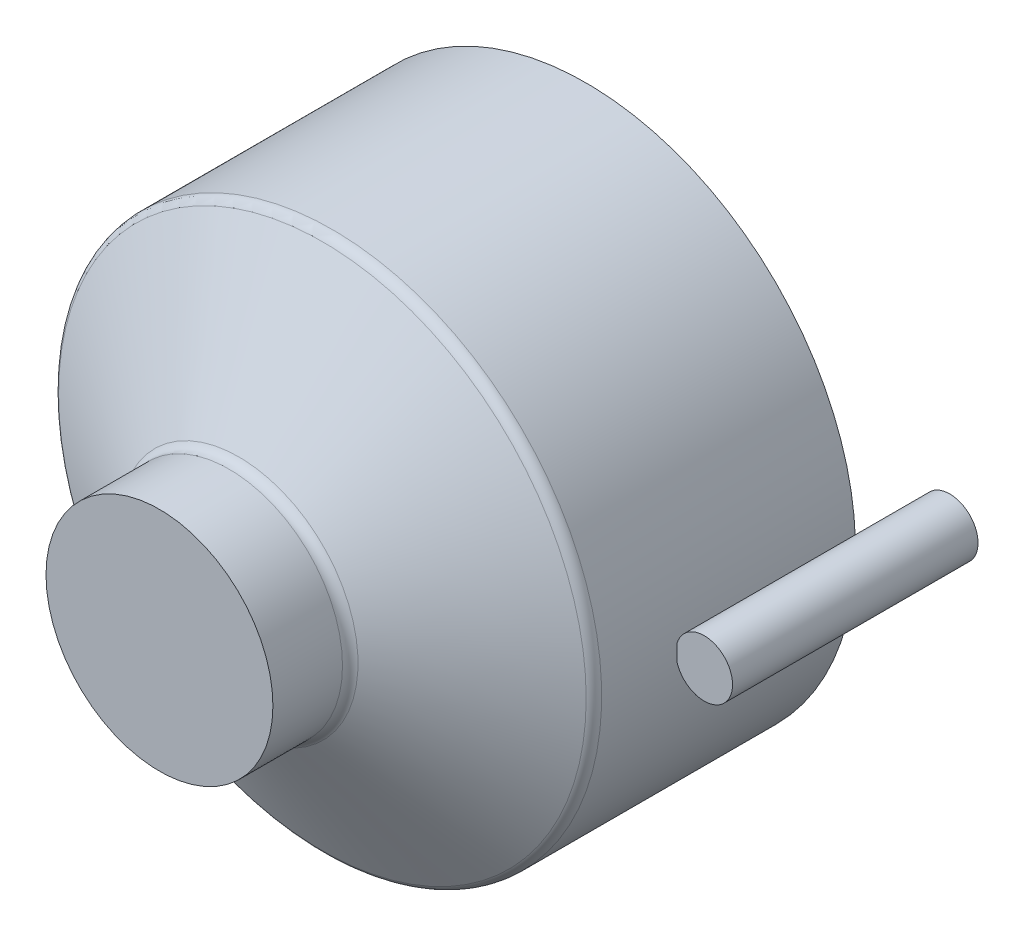
ISO-10303-21;
HEADER;
FILE_DESCRIPTION(('STEP AP214'),'2;1');
FILE_NAME('part.step','',(''),(''),'','','');
FILE_SCHEMA(('AUTOMOTIVE_DESIGN { 1 0 10303 214 1 1 1 1 }'));
ENDSEC;
DATA;
#1=APPLICATION_CONTEXT('core data for automotive mechanical design processes');
#2=APPLICATION_PROTOCOL_DEFINITION('international standard','automotive_design',2000,#1);
#3=PRODUCT_CONTEXT('',#1,'mechanical');
#4=PRODUCT('Part','Part','',(#3));
#5=PRODUCT_RELATED_PRODUCT_CATEGORY('part','',(#4));
#6=PRODUCT_DEFINITION_FORMATION('','',#4);
#7=PRODUCT_DEFINITION_CONTEXT('part definition',#1,'design');
#8=PRODUCT_DEFINITION('design','',#6,#7);
#9=PRODUCT_DEFINITION_SHAPE('','',#8);
#10=(LENGTH_UNIT() NAMED_UNIT(*) SI_UNIT(.MILLI.,.METRE.));
#11=(NAMED_UNIT(*) PLANE_ANGLE_UNIT() SI_UNIT($,.RADIAN.));
#12=(NAMED_UNIT(*) SI_UNIT($,.STERADIAN.) SOLID_ANGLE_UNIT());
#13=UNCERTAINTY_MEASURE_WITH_UNIT(LENGTH_MEASURE(1.E-05),#10,'distance_accuracy_value','');
#14=(GEOMETRIC_REPRESENTATION_CONTEXT(3) GLOBAL_UNCERTAINTY_ASSIGNED_CONTEXT((#13)) GLOBAL_UNIT_ASSIGNED_CONTEXT((#10,
#11,#12)) REPRESENTATION_CONTEXT('',''));
#15=CARTESIAN_POINT('',(0.,0.,0.));
#16=DIRECTION('',(0.,0.,1.));
#17=DIRECTION('',(1.,0.,0.));
#18=AXIS2_PLACEMENT_3D('',#15,#16,#17);
#19=CARTESIAN_POINT('',(261.5,0.,-30.6121593216774));
#20=DIRECTION('',(0.,0.,1.));
#21=DIRECTION('',(1.,0.,0.));
#22=AXIS2_PLACEMENT_3D('',#19,#20,#21);
#23=PLANE('',#22);
#24=CARTESIAN_POINT('',(0.,0.,-30.6121593216774));
#25=DIRECTION('',(0.,0.,1.));
#26=DIRECTION('',(1.,0.,0.));
#27=AXIS2_PLACEMENT_3D('',#24,#25,#26);
#28=CIRCLE('',#27,237.5);
#29=CARTESIAN_POINT('',(237.406309751434,-6.67038905957938,-30.6121593216774));
#30=VERTEX_POINT('',#29);
#31=CARTESIAN_POINT('',(237.406309751434,6.67038905957939,-30.6121593216774));
#32=VERTEX_POINT('',#31);
#33=EDGE_CURVE('E67',#30,#32,#28,.T.);
#34=ORIENTED_EDGE('',*,*,#33,.F.);
#35=CARTESIAN_POINT('',(261.5,0.,-30.6121593216774));
#36=DIRECTION('',(0.,0.,-1.));
#37=DIRECTION('',(-1.,0.,0.));
#38=AXIS2_PLACEMENT_3D('',#35,#36,#37);
#39=CIRCLE('',#38,24.9999999999999);
#40=EDGE_CURVE('E75',#32,#30,#39,.T.);
#41=ORIENTED_EDGE('',*,*,#40,.F.);
#42=EDGE_LOOP('',(#34,#41));
#43=FACE_BOUND('',#42,.T.);
#44=ADVANCED_FACE('F46',(#43),#23,.T.);
#45=CARTESIAN_POINT('',(261.5,0.,-182.650020504297));
#46=DIRECTION('',(0.,0.,-1.));
#47=DIRECTION('',(-1.,0.,0.));
#48=AXIS2_PLACEMENT_3D('',#45,#46,#47);
#49=CYLINDRICAL_SURFACE('',#48,25.);
#50=DIRECTION('',(0.,0.,-1.));
#51=VECTOR('',#50,1.);
#52=CARTESIAN_POINT('',(237.406309751434,6.6703890595794,-76.1362066797608));
#53=LINE('',#52,#51);
#54=CARTESIAN_POINT('',(237.406309751434,6.67038905958026,-188.));
#55=VERTEX_POINT('',#54);
#56=EDGE_CURVE('E11',#32,#55,#53,.T.);
#57=ORIENTED_EDGE('',*,*,#56,.F.);
#58=ORIENTED_EDGE('',*,*,#40,.T.);
#59=DIRECTION('',(0.,0.,-1.));
#60=VECTOR('',#59,1.);
#61=CARTESIAN_POINT('',(237.406309751434,-6.6703890595794,-76.1362066797608));
#62=LINE('',#61,#60);
#63=CARTESIAN_POINT('',(237.406309751434,-6.67038905958026,-188.));
#64=VERTEX_POINT('',#63);
#65=EDGE_CURVE('E54',#64,#30,#62,.F.);
#66=ORIENTED_EDGE('',*,*,#65,.F.);
#67=CARTESIAN_POINT('',(261.5,0.,-188.));
#68=DIRECTION('',(0.,0.,-1.));
#69=DIRECTION('',(-1.,0.,0.));
#70=AXIS2_PLACEMENT_3D('',#67,#68,#69);
#71=CIRCLE('',#70,25.);
#72=EDGE_CURVE('E61',#55,#64,#71,.F.);
#73=ORIENTED_EDGE('',*,*,#72,.F.);
#74=EDGE_LOOP('',(#57,#58,#66,#73));
#75=FACE_BOUND('',#74,.T.);
#76=CARTESIAN_POINT('',(261.5,0.,-247.));
#77=DIRECTION('',(0.,0.,-1.));
#78=DIRECTION('',(-1.,0.,0.));
#79=AXIS2_PLACEMENT_3D('',#76,#77,#78);
#80=CIRCLE('',#79,25.);
#81=CARTESIAN_POINT('',(236.5,0.,-247.));
#82=VERTEX_POINT('',#81);
#83=EDGE_CURVE('E109',#82,#82,#80,.T.);
#84=ORIENTED_EDGE('',*,*,#83,.F.);
#85=EDGE_LOOP('',(#84));
#86=FACE_BOUND('',#85,.T.);
#87=ADVANCED_FACE('F73',(#75,#86),#49,.T.);
#88=CARTESIAN_POINT('',(261.5,0.,-247.));
#89=DIRECTION('',(0.,0.,-1.));
#90=DIRECTION('',(-1.,0.,0.));
#91=AXIS2_PLACEMENT_3D('',#88,#89,#90);
#92=PLANE('',#91);
#93=ORIENTED_EDGE('',*,*,#83,.T.);
#94=EDGE_LOOP('',(#93));
#95=FACE_BOUND('',#94,.T.);
#96=ADVANCED_FACE('F116',(#95),#92,.T.);
#97=CARTESIAN_POINT('',(0.,0.,126.660254037844));
#98=DIRECTION('',(0.,0.,-1.));
#99=DIRECTION('',(-1.,0.,0.));
#100=AXIS2_PLACEMENT_3D('',#97,#98,#99);
#101=TOROIDAL_SURFACE('',#100,110.,10.);
#102=CARTESIAN_POINT('',(0.,0.,126.660254037844));
#103=DIRECTION('',(0.,0.,-1.));
#104=DIRECTION('',(-1.,0.,0.));
#105=AXIS2_PLACEMENT_3D('',#102,#103,#104);
#106=CIRCLE('',#105,100.);
#107=CARTESIAN_POINT('',(-100.,0.,126.660254037844));
#108=VERTEX_POINT('',#107);
#109=EDGE_CURVE('E96',#108,#108,#106,.T.);
#110=ORIENTED_EDGE('',*,*,#109,.T.);
#111=EDGE_LOOP('',(#110));
#112=FACE_BOUND('',#111,.T.);
#113=CARTESIAN_POINT('',(0.,0.,118.));
#114=DIRECTION('',(0.,0.,-1.));
#115=DIRECTION('',(-1.,0.,0.));
#116=AXIS2_PLACEMENT_3D('',#113,#114,#115);
#117=CIRCLE('',#116,105.);
#118=CARTESIAN_POINT('',(-105.,0.,118.));
#119=VERTEX_POINT('',#118);
#120=EDGE_CURVE('E103',#119,#119,#117,.T.);
#121=ORIENTED_EDGE('',*,*,#120,.F.);
#122=EDGE_LOOP('',(#121));
#123=FACE_BOUND('',#122,.T.);
#124=ADVANCED_FACE('F122',(#112,#123),#101,.F.);
#125=CARTESIAN_POINT('',(0.,0.,44.3878406783226));
#126=DIRECTION('',(0.,0.,-1.));
#127=DIRECTION('',(-1.,0.,0.));
#128=AXIS2_PLACEMENT_3D('',#125,#126,#127);
#129=CONICAL_SURFACE('',#128,232.5,1.0471975511966);
#130=ORIENTED_EDGE('',*,*,#120,.T.);
#131=EDGE_LOOP('',(#130));
#132=FACE_BOUND('',#131,.T.);
#133=CARTESIAN_POINT('',(0.,0.,44.3878406783226));
#134=DIRECTION('',(0.,0.,-1.));
#135=DIRECTION('',(-1.,0.,0.));
#136=AXIS2_PLACEMENT_3D('',#133,#134,#135);
#137=CIRCLE('',#136,232.5);
#138=CARTESIAN_POINT('',(-232.5,0.,44.3878406783226));
#139=VERTEX_POINT('',#138);
#140=EDGE_CURVE('E93',#139,#139,#137,.T.);
#141=ORIENTED_EDGE('',*,*,#140,.F.);
#142=EDGE_LOOP('',(#141));
#143=FACE_BOUND('',#142,.T.);
#144=ADVANCED_FACE('F126',(#132,#143),#129,.T.);
#145=CARTESIAN_POINT('',(0.,0.,35.7275866404782));
#146=DIRECTION('',(0.,0.,-1.));
#147=DIRECTION('',(-1.,0.,0.));
#148=AXIS2_PLACEMENT_3D('',#145,#146,#147);
#149=TOROIDAL_SURFACE('',#148,227.5,10.);
#150=ORIENTED_EDGE('',*,*,#140,.T.);
#151=EDGE_LOOP('',(#150));
#152=FACE_BOUND('',#151,.T.);
#153=CARTESIAN_POINT('',(0.,0.,35.7275866404783));
#154=DIRECTION('',(0.,0.,-1.));
#155=DIRECTION('',(-1.,0.,0.));
#156=AXIS2_PLACEMENT_3D('',#153,#154,#155);
#157=CIRCLE('',#156,237.5);
#158=CARTESIAN_POINT('',(-237.5,0.,35.7275866404783));
#159=VERTEX_POINT('',#158);
#160=EDGE_CURVE('E87',#159,#159,#157,.T.);
#161=ORIENTED_EDGE('',*,*,#160,.F.);
#162=EDGE_LOOP('',(#161));
#163=FACE_BOUND('',#162,.T.);
#164=ADVANCED_FACE('F130',(#152,#163),#149,.T.);
#165=CARTESIAN_POINT('',(0.,0.,-581.773938455746));
#166=DIRECTION('',(0.,0.,-1.));
#167=DIRECTION('',(-1.,0.,0.));
#168=AXIS2_PLACEMENT_3D('',#165,#166,#167);
#169=CYLINDRICAL_SURFACE('',#168,237.5);
#170=ORIENTED_EDGE('',*,*,#160,.T.);
#171=EDGE_LOOP('',(#170));
#172=FACE_BOUND('',#171,.T.);
#173=ORIENTED_EDGE('',*,*,#33,.T.);
#174=ORIENTED_EDGE('',*,*,#56,.T.);
#175=CARTESIAN_POINT('',(0.,0.,-188.));
#176=DIRECTION('',(0.,0.,-1.));
#177=DIRECTION('',(-1.,0.,0.));
#178=AXIS2_PLACEMENT_3D('',#175,#176,#177);
#179=CIRCLE('',#178,237.5);
#180=EDGE_CURVE('E82',#64,#55,#179,.T.);
#181=ORIENTED_EDGE('',*,*,#180,.F.);
#182=ORIENTED_EDGE('',*,*,#65,.T.);
#183=EDGE_LOOP('',(#173,#174,#181,#182));
#184=FACE_BOUND('',#183,.T.);
#185=ADVANCED_FACE('F85',(#172,#184),#169,.T.);
#186=CARTESIAN_POINT('',(-237.5,0.,-188.));
#187=DIRECTION('',(0.,0.,-1.));
#188=DIRECTION('',(-1.,0.,0.));
#189=AXIS2_PLACEMENT_3D('',#186,#187,#188);
#190=PLANE('',#189);
#191=ORIENTED_EDGE('',*,*,#180,.T.);
#192=ORIENTED_EDGE('',*,*,#72,.T.);
#193=EDGE_LOOP('',(#191,#192));
#194=FACE_BOUND('',#193,.T.);
#195=ADVANCED_FACE('F81',(#194),#190,.T.);
#196=CARTESIAN_POINT('',(-100.,0.,188.));
#197=DIRECTION('',(0.,0.,1.));
#198=DIRECTION('',(1.,0.,0.));
#199=AXIS2_PLACEMENT_3D('',#196,#197,#198);
#200=PLANE('',#199);
#201=CARTESIAN_POINT('',(0.,0.,188.));
#202=DIRECTION('',(0.,0.,-1.));
#203=DIRECTION('',(-1.,0.,0.));
#204=AXIS2_PLACEMENT_3D('',#201,#202,#203);
#205=CIRCLE('',#204,100.);
#206=CARTESIAN_POINT('',(-100.,0.,188.));
#207=VERTEX_POINT('',#206);
#208=EDGE_CURVE('E88',#207,#207,#205,.T.);
#209=ORIENTED_EDGE('',*,*,#208,.F.);
#210=EDGE_LOOP('',(#209));
#211=FACE_BOUND('',#210,.T.);
#212=ADVANCED_FACE('F140',(#211),#200,.T.);
#213=CARTESIAN_POINT('',(0.,0.,-581.773938455746));
#214=DIRECTION('',(0.,0.,-1.));
#215=DIRECTION('',(-1.,0.,0.));
#216=AXIS2_PLACEMENT_3D('',#213,#214,#215);
#217=CYLINDRICAL_SURFACE('',#216,100.);
#218=ORIENTED_EDGE('',*,*,#208,.T.);
#219=EDGE_LOOP('',(#218));
#220=FACE_BOUND('',#219,.T.);
#221=ORIENTED_EDGE('',*,*,#109,.F.);
#222=EDGE_LOOP('',(#221));
#223=FACE_BOUND('',#222,.T.);
#224=ADVANCED_FACE('F143',(#220,#223),#217,.T.);
#225=CLOSED_SHELL('',(#44,#87,#96,#124,#144,#164,#185,#195,#212,#224));
#226=MANIFOLD_SOLID_BREP('B2',#225);
#227=ADVANCED_BREP_SHAPE_REPRESENTATION('',(#18,#226),#14);
#228=SHAPE_DEFINITION_REPRESENTATION(#9,#227);
ENDSEC;
END-ISO-10303-21;
